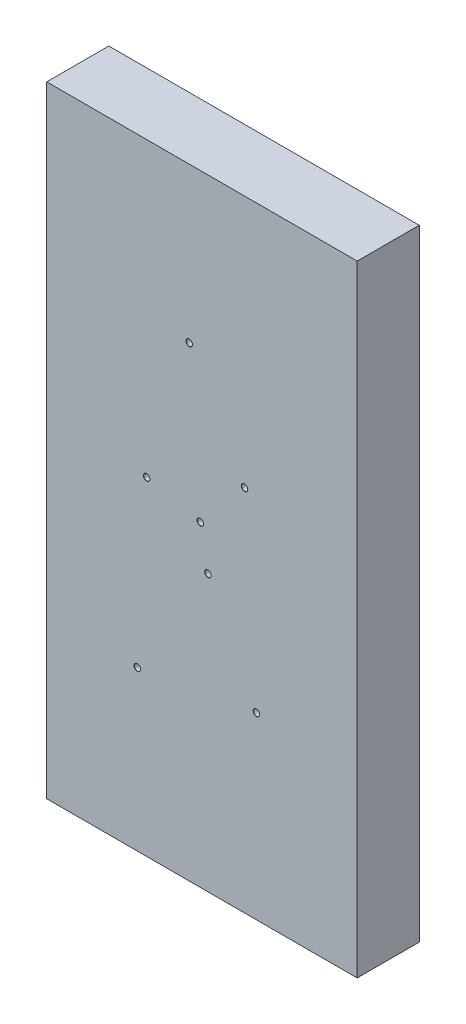
ISO-10303-21;
HEADER;
FILE_DESCRIPTION(('STEP AP214'),'2;1');
FILE_NAME('part.step','',(''),(''),'','','');
FILE_SCHEMA(('AUTOMOTIVE_DESIGN { 1 0 10303 214 1 1 1 1 }'));
ENDSEC;
DATA;
#1=APPLICATION_CONTEXT('core data for automotive mechanical design processes');
#2=APPLICATION_PROTOCOL_DEFINITION('international standard','automotive_design',2000,#1);
#3=PRODUCT_CONTEXT('',#1,'mechanical');
#4=PRODUCT('Part','Part','',(#3));
#5=PRODUCT_RELATED_PRODUCT_CATEGORY('part','',(#4));
#6=PRODUCT_DEFINITION_FORMATION('','',#4);
#7=PRODUCT_DEFINITION_CONTEXT('part definition',#1,'design');
#8=PRODUCT_DEFINITION('design','',#6,#7);
#9=PRODUCT_DEFINITION_SHAPE('','',#8);
#10=(LENGTH_UNIT() NAMED_UNIT(*) SI_UNIT(.MILLI.,.METRE.));
#11=(NAMED_UNIT(*) PLANE_ANGLE_UNIT() SI_UNIT($,.RADIAN.));
#12=(NAMED_UNIT(*) SI_UNIT($,.STERADIAN.) SOLID_ANGLE_UNIT());
#13=UNCERTAINTY_MEASURE_WITH_UNIT(LENGTH_MEASURE(1.E-05),#10,'distance_accuracy_value','');
#14=(GEOMETRIC_REPRESENTATION_CONTEXT(3) GLOBAL_UNCERTAINTY_ASSIGNED_CONTEXT((#13)) GLOBAL_UNIT_ASSIGNED_CONTEXT((#10,
#11,#12)) REPRESENTATION_CONTEXT('',''));
#15=CARTESIAN_POINT('',(0.,0.,0.));
#16=DIRECTION('',(0.,0.,1.));
#17=DIRECTION('',(1.,0.,0.));
#18=AXIS2_PLACEMENT_3D('',#15,#16,#17);
#19=CARTESIAN_POINT('',(-25.,50.,10.));
#20=DIRECTION('',(0.,1.,0.));
#21=DIRECTION('',(0.,0.,1.));
#22=AXIS2_PLACEMENT_3D('',#19,#20,#21);
#23=PLANE('',#22);
#24=DIRECTION('',(1.,0.,0.));
#25=VECTOR('',#24,1.);
#26=CARTESIAN_POINT('',(-25.,50.,0.));
#27=LINE('',#26,#25);
#28=CARTESIAN_POINT('',(-25.,50.,0.));
#29=VERTEX_POINT('',#28);
#30=CARTESIAN_POINT('',(25.,50.,0.));
#31=VERTEX_POINT('',#30);
#32=EDGE_CURVE('E103',#29,#31,#27,.T.);
#33=ORIENTED_EDGE('',*,*,#32,.F.);
#34=DIRECTION('',(0.,0.,-1.));
#35=VECTOR('',#34,1.);
#36=CARTESIAN_POINT('',(-25.,50.,10.));
#37=LINE('',#36,#35);
#38=CARTESIAN_POINT('',(-25.,50.,10.));
#39=VERTEX_POINT('',#38);
#40=EDGE_CURVE('E11',#39,#29,#37,.T.);
#41=ORIENTED_EDGE('',*,*,#40,.F.);
#42=DIRECTION('',(1.,0.,0.));
#43=VECTOR('',#42,1.);
#44=CARTESIAN_POINT('',(-25.,50.,10.));
#45=LINE('',#44,#43);
#46=CARTESIAN_POINT('',(25.,50.,10.));
#47=VERTEX_POINT('',#46);
#48=EDGE_CURVE('E98',#39,#47,#45,.T.);
#49=ORIENTED_EDGE('',*,*,#48,.T.);
#50=DIRECTION('',(0.,0.,-1.));
#51=VECTOR('',#50,1.);
#52=CARTESIAN_POINT('',(25.,50.,10.));
#53=LINE('',#52,#51);
#54=EDGE_CURVE('E45',#47,#31,#53,.T.);
#55=ORIENTED_EDGE('',*,*,#54,.T.);
#56=EDGE_LOOP('',(#33,#41,#49,#55));
#57=FACE_BOUND('',#56,.T.);
#58=ADVANCED_FACE('F39',(#57),#23,.T.);
#59=CARTESIAN_POINT('',(-25.,50.,10.));
#60=DIRECTION('',(1.,0.,0.));
#61=DIRECTION('',(0.,1.,0.));
#62=AXIS2_PLACEMENT_3D('',#59,#60,#61);
#63=PLANE('',#62);
#64=DIRECTION('',(0.,-1.,0.));
#65=VECTOR('',#64,1.);
#66=CARTESIAN_POINT('',(-25.,50.,0.));
#67=LINE('',#66,#65);
#68=CARTESIAN_POINT('',(-25.,-50.,0.));
#69=VERTEX_POINT('',#68);
#70=EDGE_CURVE('E75',#29,#69,#67,.T.);
#71=ORIENTED_EDGE('',*,*,#70,.T.);
#72=DIRECTION('',(0.,0.,-1.));
#73=VECTOR('',#72,1.);
#74=CARTESIAN_POINT('',(-25.,-50.,10.));
#75=LINE('',#74,#73);
#76=CARTESIAN_POINT('',(-25.,-50.,10.));
#77=VERTEX_POINT('',#76);
#78=EDGE_CURVE('E48',#77,#69,#75,.T.);
#79=ORIENTED_EDGE('',*,*,#78,.F.);
#80=DIRECTION('',(0.,-1.,0.));
#81=VECTOR('',#80,1.);
#82=CARTESIAN_POINT('',(-25.,50.,10.));
#83=LINE('',#82,#81);
#84=EDGE_CURVE('E87',#39,#77,#83,.T.);
#85=ORIENTED_EDGE('',*,*,#84,.F.);
#86=ORIENTED_EDGE('',*,*,#40,.T.);
#87=EDGE_LOOP('',(#71,#79,#85,#86));
#88=FACE_BOUND('',#87,.T.);
#89=ADVANCED_FACE('F118',(#88),#63,.F.);
#90=CARTESIAN_POINT('',(-25.,-50.,10.));
#91=DIRECTION('',(0.,1.,0.));
#92=DIRECTION('',(0.,0.,1.));
#93=AXIS2_PLACEMENT_3D('',#90,#91,#92);
#94=PLANE('',#93);
#95=DIRECTION('',(1.,0.,0.));
#96=VECTOR('',#95,1.);
#97=CARTESIAN_POINT('',(-25.,-50.,0.));
#98=LINE('',#97,#96);
#99=CARTESIAN_POINT('',(25.,-50.,0.));
#100=VERTEX_POINT('',#99);
#101=EDGE_CURVE('E96',#69,#100,#98,.T.);
#102=ORIENTED_EDGE('',*,*,#101,.T.);
#103=DIRECTION('',(0.,0.,-1.));
#104=VECTOR('',#103,1.);
#105=CARTESIAN_POINT('',(25.,-50.,10.));
#106=LINE('',#105,#104);
#107=CARTESIAN_POINT('',(25.,-50.,10.));
#108=VERTEX_POINT('',#107);
#109=EDGE_CURVE('E93',#108,#100,#106,.T.);
#110=ORIENTED_EDGE('',*,*,#109,.F.);
#111=DIRECTION('',(1.,0.,0.));
#112=VECTOR('',#111,1.);
#113=CARTESIAN_POINT('',(-25.,-50.,10.));
#114=LINE('',#113,#112);
#115=EDGE_CURVE('E84',#77,#108,#114,.T.);
#116=ORIENTED_EDGE('',*,*,#115,.F.);
#117=ORIENTED_EDGE('',*,*,#78,.T.);
#118=EDGE_LOOP('',(#102,#110,#116,#117));
#119=FACE_BOUND('',#118,.T.);
#120=ADVANCED_FACE('F92',(#119),#94,.F.);
#121=CARTESIAN_POINT('',(25.,50.,10.));
#122=DIRECTION('',(1.,0.,0.));
#123=DIRECTION('',(0.,1.,0.));
#124=AXIS2_PLACEMENT_3D('',#121,#122,#123);
#125=PLANE('',#124);
#126=DIRECTION('',(0.,-1.,0.));
#127=VECTOR('',#126,1.);
#128=CARTESIAN_POINT('',(25.,50.,0.));
#129=LINE('',#128,#127);
#130=EDGE_CURVE('E106',#31,#100,#129,.T.);
#131=ORIENTED_EDGE('',*,*,#130,.F.);
#132=ORIENTED_EDGE('',*,*,#54,.F.);
#133=DIRECTION('',(0.,-1.,0.));
#134=VECTOR('',#133,1.);
#135=CARTESIAN_POINT('',(25.,50.,10.));
#136=LINE('',#135,#134);
#137=EDGE_CURVE('E88',#47,#108,#136,.T.);
#138=ORIENTED_EDGE('',*,*,#137,.T.);
#139=ORIENTED_EDGE('',*,*,#109,.T.);
#140=EDGE_LOOP('',(#131,#132,#138,#139));
#141=FACE_BOUND('',#140,.T.);
#142=ADVANCED_FACE('F97',(#141),#125,.T.);
#143=CARTESIAN_POINT('',(0.,0.,10.));
#144=DIRECTION('',(0.,0.,-1.));
#145=DIRECTION('',(-1.,0.,0.));
#146=AXIS2_PLACEMENT_3D('',#143,#144,#145);
#147=PLANE('',#146);
#148=CARTESIAN_POINT('',(-0.274115762512961,0.959405168795363,10.));
#149=DIRECTION('',(0.,0.,1.));
#150=DIRECTION('',(1.,0.,0.));
#151=AXIS2_PLACEMENT_3D('',#148,#149,#150);
#152=CIRCLE('',#151,0.524999999999999);
#153=CARTESIAN_POINT('',(0.250884237487039,0.959405168795363,10.));
#154=VERTEX_POINT('',#153);
#155=EDGE_CURVE('E202',#154,#154,#152,.T.);
#156=ORIENTED_EDGE('',*,*,#155,.F.);
#157=EDGE_LOOP('',(#156));
#158=FACE_BOUND('',#157,.T.);
#159=CARTESIAN_POINT('',(0.959405168795363,-5.61937313151559,10.));
#160=DIRECTION('',(0.,0.,1.));
#161=DIRECTION('',(1.,0.,0.));
#162=AXIS2_PLACEMENT_3D('',#159,#160,#161);
#163=CIRCLE('',#162,0.524999999999999);
#164=CARTESIAN_POINT('',(1.48440516879536,-5.61937313151559,10.));
#165=VERTEX_POINT('',#164);
#166=EDGE_CURVE('E206',#165,#165,#163,.T.);
#167=ORIENTED_EDGE('',*,*,#166,.F.);
#168=EDGE_LOOP('',(#167));
#169=FACE_BOUND('',#168,.T.);
#170=CARTESIAN_POINT('',(-8.90876228167106,2.87821550638606,10.));
#171=DIRECTION('',(0.,0.,1.));
#172=DIRECTION('',(1.,0.,0.));
#173=AXIS2_PLACEMENT_3D('',#170,#171,#172);
#174=CIRCLE('',#173,0.524999999999999);
#175=CARTESIAN_POINT('',(-8.38376228167106,2.87821550638606,10.));
#176=VERTEX_POINT('',#175);
#177=EDGE_CURVE('E220',#176,#176,#174,.T.);
#178=ORIENTED_EDGE('',*,*,#177,.F.);
#179=EDGE_LOOP('',(#178));
#180=FACE_BOUND('',#179,.T.);
#181=CARTESIAN_POINT('',(6.85289406282391,9.31993592544053,10.));
#182=DIRECTION('',(0.,0.,1.));
#183=DIRECTION('',(1.,0.,0.));
#184=AXIS2_PLACEMENT_3D('',#181,#182,#183);
#185=CIRCLE('',#184,0.524999999999999);
#186=CARTESIAN_POINT('',(7.37789406282391,9.31993592544053,10.));
#187=VERTEX_POINT('',#186);
#188=EDGE_CURVE('E226',#187,#187,#185,.T.);
#189=ORIENTED_EDGE('',*,*,#188,.F.);
#190=EDGE_LOOP('',(#189));
#191=FACE_BOUND('',#190,.T.);
#192=CARTESIAN_POINT('',(-2.05586821884718,25.0815922699355,10.));
#193=DIRECTION('',(0.,0.,1.));
#194=DIRECTION('',(1.,0.,0.));
#195=AXIS2_PLACEMENT_3D('',#192,#193,#194);
#196=CIRCLE('',#195,0.524999999999999);
#197=CARTESIAN_POINT('',(-1.53086821884718,25.0815922699355,10.));
#198=VERTEX_POINT('',#197);
#199=EDGE_CURVE('E234',#198,#198,#196,.T.);
#200=ORIENTED_EDGE('',*,*,#199,.F.);
#201=EDGE_LOOP('',(#200));
#202=FACE_BOUND('',#201,.T.);
#203=CARTESIAN_POINT('',(8.77170440041461,-21.1069137134976,10.));
#204=DIRECTION('',(0.,0.,1.));
#205=DIRECTION('',(1.,0.,0.));
#206=AXIS2_PLACEMENT_3D('',#203,#204,#205);
#207=CIRCLE('',#206,0.524999999999999);
#208=CARTESIAN_POINT('',(9.29670440041461,-21.1069137134976,10.));
#209=VERTEX_POINT('',#208);
#210=EDGE_CURVE('E242',#209,#209,#207,.T.);
#211=ORIENTED_EDGE('',*,*,#210,.F.);
#212=EDGE_LOOP('',(#211));
#213=FACE_BOUND('',#212,.T.);
#214=CARTESIAN_POINT('',(-10.4163989754923,-24.3963028636531,10.));
#215=DIRECTION('',(0.,0.,1.));
#216=DIRECTION('',(1.,0.,0.));
#217=AXIS2_PLACEMENT_3D('',#214,#215,#216);
#218=CIRCLE('',#217,0.524999999999999);
#219=CARTESIAN_POINT('',(-9.89139897549235,-24.3963028636531,10.));
#220=VERTEX_POINT('',#219);
#221=EDGE_CURVE('E251',#220,#220,#218,.T.);
#222=ORIENTED_EDGE('',*,*,#221,.F.);
#223=EDGE_LOOP('',(#222));
#224=FACE_BOUND('',#223,.T.);
#225=ORIENTED_EDGE('',*,*,#48,.F.);
#226=ORIENTED_EDGE('',*,*,#84,.T.);
#227=ORIENTED_EDGE('',*,*,#115,.T.);
#228=ORIENTED_EDGE('',*,*,#137,.F.);
#229=EDGE_LOOP('',(#225,#226,#227,#228));
#230=FACE_BOUND('',#229,.T.);
#231=ADVANCED_FACE('F90',(#158,#169,#180,#191,#202,#213,#224,#230),#147,.F.);
#232=CARTESIAN_POINT('',(0.,0.,0.));
#233=DIRECTION('',(0.,0.,-1.));
#234=DIRECTION('',(-1.,0.,0.));
#235=AXIS2_PLACEMENT_3D('',#232,#233,#234);
#236=PLANE('',#235);
#237=CARTESIAN_POINT('',(-0.274115762512961,0.959405168795363,0.));
#238=DIRECTION('',(0.,0.,1.));
#239=DIRECTION('',(1.,0.,0.));
#240=AXIS2_PLACEMENT_3D('',#237,#238,#239);
#241=CIRCLE('',#240,0.499999999999999);
#242=CARTESIAN_POINT('',(0.225884237487038,0.959405168795363,0.));
#243=VERTEX_POINT('',#242);
#244=EDGE_CURVE('E201',#243,#243,#241,.T.);
#245=ORIENTED_EDGE('',*,*,#244,.T.);
#246=EDGE_LOOP('',(#245));
#247=FACE_BOUND('',#246,.T.);
#248=CARTESIAN_POINT('',(0.959405168795363,-5.61937313151559,0.));
#249=DIRECTION('',(0.,0.,1.));
#250=DIRECTION('',(1.,0.,0.));
#251=AXIS2_PLACEMENT_3D('',#248,#249,#250);
#252=CIRCLE('',#251,0.499999999999999);
#253=CARTESIAN_POINT('',(1.45940516879536,-5.61937313151559,0.));
#254=VERTEX_POINT('',#253);
#255=EDGE_CURVE('E215',#254,#254,#252,.T.);
#256=ORIENTED_EDGE('',*,*,#255,.T.);
#257=EDGE_LOOP('',(#256));
#258=FACE_BOUND('',#257,.T.);
#259=CARTESIAN_POINT('',(-8.90876228167106,2.87821550638606,0.));
#260=DIRECTION('',(0.,0.,1.));
#261=DIRECTION('',(1.,0.,0.));
#262=AXIS2_PLACEMENT_3D('',#259,#260,#261);
#263=CIRCLE('',#262,0.499999999999999);
#264=CARTESIAN_POINT('',(-8.40876228167106,2.87821550638606,0.));
#265=VERTEX_POINT('',#264);
#266=EDGE_CURVE('E223',#265,#265,#263,.T.);
#267=ORIENTED_EDGE('',*,*,#266,.T.);
#268=EDGE_LOOP('',(#267));
#269=FACE_BOUND('',#268,.T.);
#270=CARTESIAN_POINT('',(6.85289406282391,9.31993592544053,0.));
#271=DIRECTION('',(0.,0.,1.));
#272=DIRECTION('',(1.,0.,0.));
#273=AXIS2_PLACEMENT_3D('',#270,#271,#272);
#274=CIRCLE('',#273,0.499999999999999);
#275=CARTESIAN_POINT('',(7.35289406282391,9.31993592544053,0.));
#276=VERTEX_POINT('',#275);
#277=EDGE_CURVE('E235',#276,#276,#274,.T.);
#278=ORIENTED_EDGE('',*,*,#277,.T.);
#279=EDGE_LOOP('',(#278));
#280=FACE_BOUND('',#279,.T.);
#281=CARTESIAN_POINT('',(-2.05586821884718,25.0815922699355,0.));
#282=DIRECTION('',(0.,0.,1.));
#283=DIRECTION('',(1.,0.,0.));
#284=AXIS2_PLACEMENT_3D('',#281,#282,#283);
#285=CIRCLE('',#284,0.499999999999999);
#286=CARTESIAN_POINT('',(-1.55586821884718,25.0815922699355,0.));
#287=VERTEX_POINT('',#286);
#288=EDGE_CURVE('E243',#287,#287,#285,.T.);
#289=ORIENTED_EDGE('',*,*,#288,.T.);
#290=EDGE_LOOP('',(#289));
#291=FACE_BOUND('',#290,.T.);
#292=CARTESIAN_POINT('',(8.77170440041461,-21.1069137134976,0.));
#293=DIRECTION('',(0.,0.,1.));
#294=DIRECTION('',(1.,0.,0.));
#295=AXIS2_PLACEMENT_3D('',#292,#293,#294);
#296=CIRCLE('',#295,0.499999999999999);
#297=CARTESIAN_POINT('',(9.27170440041461,-21.1069137134976,0.));
#298=VERTEX_POINT('',#297);
#299=EDGE_CURVE('E248',#298,#298,#296,.T.);
#300=ORIENTED_EDGE('',*,*,#299,.T.);
#301=EDGE_LOOP('',(#300));
#302=FACE_BOUND('',#301,.T.);
#303=CARTESIAN_POINT('',(-10.4163989754923,-24.3963028636531,0.));
#304=DIRECTION('',(0.,0.,1.));
#305=DIRECTION('',(1.,0.,0.));
#306=AXIS2_PLACEMENT_3D('',#303,#304,#305);
#307=CIRCLE('',#306,0.499999999999999);
#308=CARTESIAN_POINT('',(-9.91639897549235,-24.3963028636531,0.));
#309=VERTEX_POINT('',#308);
#310=EDGE_CURVE('E107',#309,#309,#307,.T.);
#311=ORIENTED_EDGE('',*,*,#310,.T.);
#312=EDGE_LOOP('',(#311));
#313=FACE_BOUND('',#312,.T.);
#314=ORIENTED_EDGE('',*,*,#32,.T.);
#315=ORIENTED_EDGE('',*,*,#130,.T.);
#316=ORIENTED_EDGE('',*,*,#101,.F.);
#317=ORIENTED_EDGE('',*,*,#70,.F.);
#318=EDGE_LOOP('',(#314,#315,#316,#317));
#319=FACE_BOUND('',#318,.T.);
#320=ADVANCED_FACE('F114',(#247,#258,#269,#280,#291,#302,#313,#319),#236,.T.);
#321=CARTESIAN_POINT('',(-10.4163989754923,-24.3963028636531,10.));
#322=DIRECTION('',(0.,0.,1.));
#323=DIRECTION('',(1.,0.,0.));
#324=AXIS2_PLACEMENT_3D('',#321,#322,#323);
#325=CYLINDRICAL_SURFACE('',#324,0.5);
#326=ORIENTED_EDGE('',*,*,#310,.F.);
#327=EDGE_LOOP('',(#326));
#328=FACE_BOUND('',#327,.T.);
#329=CARTESIAN_POINT('',(-10.4163989754923,-24.3963028636531,9.975));
#330=DIRECTION('',(0.,0.,1.));
#331=DIRECTION('',(1.,0.,0.));
#332=AXIS2_PLACEMENT_3D('',#329,#330,#331);
#333=CIRCLE('',#332,0.5);
#334=CARTESIAN_POINT('',(-9.91639897549235,-24.3963028636531,9.975));
#335=VERTEX_POINT('',#334);
#336=EDGE_CURVE('E258',#335,#335,#333,.T.);
#337=ORIENTED_EDGE('',*,*,#336,.T.);
#338=EDGE_LOOP('',(#337));
#339=FACE_BOUND('',#338,.T.);
#340=ADVANCED_FACE('F134',(#328,#339),#325,.F.);
#341=CARTESIAN_POINT('',(-10.4163989754923,-24.3963028636531,10.));
#342=DIRECTION('',(0.,0.,1.));
#343=DIRECTION('',(1.,0.,0.));
#344=AXIS2_PLACEMENT_3D('',#341,#342,#343);
#345=CONICAL_SURFACE('',#344,0.524999999999999,0.785398163397379);
#346=ORIENTED_EDGE('',*,*,#336,.F.);
#347=EDGE_LOOP('',(#346));
#348=FACE_BOUND('',#347,.T.);
#349=ORIENTED_EDGE('',*,*,#221,.T.);
#350=EDGE_LOOP('',(#349));
#351=FACE_BOUND('',#350,.T.);
#352=ADVANCED_FACE('F145',(#348,#351),#345,.F.);
#353=CARTESIAN_POINT('',(8.77170440041461,-21.1069137134976,10.));
#354=DIRECTION('',(0.,0.,1.));
#355=DIRECTION('',(1.,0.,0.));
#356=AXIS2_PLACEMENT_3D('',#353,#354,#355);
#357=CYLINDRICAL_SURFACE('',#356,0.5);
#358=ORIENTED_EDGE('',*,*,#299,.F.);
#359=EDGE_LOOP('',(#358));
#360=FACE_BOUND('',#359,.T.);
#361=CARTESIAN_POINT('',(8.77170440041461,-21.1069137134976,9.975));
#362=DIRECTION('',(0.,0.,1.));
#363=DIRECTION('',(1.,0.,0.));
#364=AXIS2_PLACEMENT_3D('',#361,#362,#363);
#365=CIRCLE('',#364,0.5);
#366=CARTESIAN_POINT('',(9.27170440041461,-21.1069137134976,9.975));
#367=VERTEX_POINT('',#366);
#368=EDGE_CURVE('E250',#367,#367,#365,.T.);
#369=ORIENTED_EDGE('',*,*,#368,.T.);
#370=EDGE_LOOP('',(#369));
#371=FACE_BOUND('',#370,.T.);
#372=ADVANCED_FACE('F147',(#360,#371),#357,.F.);
#373=CARTESIAN_POINT('',(8.77170440041461,-21.1069137134976,10.));
#374=DIRECTION('',(0.,0.,1.));
#375=DIRECTION('',(1.,0.,0.));
#376=AXIS2_PLACEMENT_3D('',#373,#374,#375);
#377=CONICAL_SURFACE('',#376,0.524999999999999,0.785398163397379);
#378=ORIENTED_EDGE('',*,*,#368,.F.);
#379=EDGE_LOOP('',(#378));
#380=FACE_BOUND('',#379,.T.);
#381=ORIENTED_EDGE('',*,*,#210,.T.);
#382=EDGE_LOOP('',(#381));
#383=FACE_BOUND('',#382,.T.);
#384=ADVANCED_FACE('F148',(#380,#383),#377,.F.);
#385=CARTESIAN_POINT('',(-2.05586821884718,25.0815922699355,10.));
#386=DIRECTION('',(0.,0.,1.));
#387=DIRECTION('',(1.,0.,0.));
#388=AXIS2_PLACEMENT_3D('',#385,#386,#387);
#389=CYLINDRICAL_SURFACE('',#388,0.499999999999999);
#390=ORIENTED_EDGE('',*,*,#288,.F.);
#391=EDGE_LOOP('',(#390));
#392=FACE_BOUND('',#391,.T.);
#393=CARTESIAN_POINT('',(-2.05586821884718,25.0815922699355,9.975));
#394=DIRECTION('',(0.,0.,1.));
#395=DIRECTION('',(1.,0.,0.));
#396=AXIS2_PLACEMENT_3D('',#393,#394,#395);
#397=CIRCLE('',#396,0.5);
#398=CARTESIAN_POINT('',(-1.55586821884718,25.0815922699355,9.975));
#399=VERTEX_POINT('',#398);
#400=EDGE_CURVE('E239',#399,#399,#397,.T.);
#401=ORIENTED_EDGE('',*,*,#400,.T.);
#402=EDGE_LOOP('',(#401));
#403=FACE_BOUND('',#402,.T.);
#404=ADVANCED_FACE('F152',(#392,#403),#389,.F.);
#405=CARTESIAN_POINT('',(-2.05586821884718,25.0815922699355,10.));
#406=DIRECTION('',(0.,0.,1.));
#407=DIRECTION('',(1.,0.,0.));
#408=AXIS2_PLACEMENT_3D('',#405,#406,#407);
#409=CONICAL_SURFACE('',#408,0.524999999999999,0.785398163397388);
#410=ORIENTED_EDGE('',*,*,#400,.F.);
#411=EDGE_LOOP('',(#410));
#412=FACE_BOUND('',#411,.T.);
#413=ORIENTED_EDGE('',*,*,#199,.T.);
#414=EDGE_LOOP('',(#413));
#415=FACE_BOUND('',#414,.T.);
#416=ADVANCED_FACE('F156',(#412,#415),#409,.F.);
#417=CARTESIAN_POINT('',(6.85289406282391,9.31993592544053,10.));
#418=DIRECTION('',(0.,0.,1.));
#419=DIRECTION('',(1.,0.,0.));
#420=AXIS2_PLACEMENT_3D('',#417,#418,#419);
#421=CYLINDRICAL_SURFACE('',#420,0.5);
#422=ORIENTED_EDGE('',*,*,#277,.F.);
#423=EDGE_LOOP('',(#422));
#424=FACE_BOUND('',#423,.T.);
#425=CARTESIAN_POINT('',(6.85289406282391,9.31993592544053,9.975));
#426=DIRECTION('',(0.,0.,1.));
#427=DIRECTION('',(1.,0.,0.));
#428=AXIS2_PLACEMENT_3D('',#425,#426,#427);
#429=CIRCLE('',#428,0.5);
#430=CARTESIAN_POINT('',(7.35289406282391,9.31993592544053,9.975));
#431=VERTEX_POINT('',#430);
#432=EDGE_CURVE('E227',#431,#431,#429,.T.);
#433=ORIENTED_EDGE('',*,*,#432,.T.);
#434=EDGE_LOOP('',(#433));
#435=FACE_BOUND('',#434,.T.);
#436=ADVANCED_FACE('F165',(#424,#435),#421,.F.);
#437=CARTESIAN_POINT('',(6.85289406282391,9.31993592544053,10.));
#438=DIRECTION('',(0.,0.,1.));
#439=DIRECTION('',(1.,0.,0.));
#440=AXIS2_PLACEMENT_3D('',#437,#438,#439);
#441=CONICAL_SURFACE('',#440,0.524999999999999,0.785398163397379);
#442=ORIENTED_EDGE('',*,*,#432,.F.);
#443=EDGE_LOOP('',(#442));
#444=FACE_BOUND('',#443,.T.);
#445=ORIENTED_EDGE('',*,*,#188,.T.);
#446=EDGE_LOOP('',(#445));
#447=FACE_BOUND('',#446,.T.);
#448=ADVANCED_FACE('F168',(#444,#447),#441,.F.);
#449=CARTESIAN_POINT('',(-8.90876228167106,2.87821550638606,10.));
#450=DIRECTION('',(0.,0.,1.));
#451=DIRECTION('',(1.,0.,0.));
#452=AXIS2_PLACEMENT_3D('',#449,#450,#451);
#453=CYLINDRICAL_SURFACE('',#452,0.5);
#454=ORIENTED_EDGE('',*,*,#266,.F.);
#455=EDGE_LOOP('',(#454));
#456=FACE_BOUND('',#455,.T.);
#457=CARTESIAN_POINT('',(-8.90876228167106,2.87821550638606,9.975));
#458=DIRECTION('',(0.,0.,1.));
#459=DIRECTION('',(1.,0.,0.));
#460=AXIS2_PLACEMENT_3D('',#457,#458,#459);
#461=CIRCLE('',#460,0.5);
#462=CARTESIAN_POINT('',(-8.40876228167106,2.87821550638606,9.975));
#463=VERTEX_POINT('',#462);
#464=EDGE_CURVE('E217',#463,#463,#461,.T.);
#465=ORIENTED_EDGE('',*,*,#464,.T.);
#466=EDGE_LOOP('',(#465));
#467=FACE_BOUND('',#466,.T.);
#468=ADVANCED_FACE('F169',(#456,#467),#453,.F.);
#469=CARTESIAN_POINT('',(-8.90876228167106,2.87821550638606,10.));
#470=DIRECTION('',(0.,0.,1.));
#471=DIRECTION('',(1.,0.,0.));
#472=AXIS2_PLACEMENT_3D('',#469,#470,#471);
#473=CONICAL_SURFACE('',#472,0.524999999999999,0.785398163397379);
#474=ORIENTED_EDGE('',*,*,#464,.F.);
#475=EDGE_LOOP('',(#474));
#476=FACE_BOUND('',#475,.T.);
#477=ORIENTED_EDGE('',*,*,#177,.T.);
#478=EDGE_LOOP('',(#477));
#479=FACE_BOUND('',#478,.T.);
#480=ADVANCED_FACE('F174',(#476,#479),#473,.F.);
#481=CARTESIAN_POINT('',(0.959405168795363,-5.61937313151559,10.));
#482=DIRECTION('',(0.,0.,1.));
#483=DIRECTION('',(1.,0.,0.));
#484=AXIS2_PLACEMENT_3D('',#481,#482,#483);
#485=CYLINDRICAL_SURFACE('',#484,0.499999999999999);
#486=ORIENTED_EDGE('',*,*,#255,.F.);
#487=EDGE_LOOP('',(#486));
#488=FACE_BOUND('',#487,.T.);
#489=CARTESIAN_POINT('',(0.959405168795363,-5.61937313151559,9.975));
#490=DIRECTION('',(0.,0.,1.));
#491=DIRECTION('',(1.,0.,0.));
#492=AXIS2_PLACEMENT_3D('',#489,#490,#491);
#493=CIRCLE('',#492,0.5);
#494=CARTESIAN_POINT('',(1.45940516879536,-5.61937313151559,9.975));
#495=VERTEX_POINT('',#494);
#496=EDGE_CURVE('E213',#495,#495,#493,.T.);
#497=ORIENTED_EDGE('',*,*,#496,.T.);
#498=EDGE_LOOP('',(#497));
#499=FACE_BOUND('',#498,.T.);
#500=ADVANCED_FACE('F178',(#488,#499),#485,.F.);
#501=CARTESIAN_POINT('',(0.959405168795363,-5.61937313151559,10.));
#502=DIRECTION('',(0.,0.,1.));
#503=DIRECTION('',(1.,0.,0.));
#504=AXIS2_PLACEMENT_3D('',#501,#502,#503);
#505=CONICAL_SURFACE('',#504,0.524999999999999,0.785398163397388);
#506=ORIENTED_EDGE('',*,*,#496,.F.);
#507=EDGE_LOOP('',(#506));
#508=FACE_BOUND('',#507,.T.);
#509=ORIENTED_EDGE('',*,*,#166,.T.);
#510=EDGE_LOOP('',(#509));
#511=FACE_BOUND('',#510,.T.);
#512=ADVANCED_FACE('F185',(#508,#511),#505,.F.);
#513=CARTESIAN_POINT('',(-0.274115762512961,0.959405168795363,10.));
#514=DIRECTION('',(0.,0.,1.));
#515=DIRECTION('',(1.,0.,0.));
#516=AXIS2_PLACEMENT_3D('',#513,#514,#515);
#517=CYLINDRICAL_SURFACE('',#516,0.499999999999999);
#518=ORIENTED_EDGE('',*,*,#244,.F.);
#519=EDGE_LOOP('',(#518));
#520=FACE_BOUND('',#519,.T.);
#521=CARTESIAN_POINT('',(-0.274115762512961,0.959405168795363,9.975));
#522=DIRECTION('',(0.,0.,1.));
#523=DIRECTION('',(1.,0.,0.));
#524=AXIS2_PLACEMENT_3D('',#521,#522,#523);
#525=CIRCLE('',#524,0.5);
#526=CARTESIAN_POINT('',(0.225884237487039,0.959405168795363,9.975));
#527=VERTEX_POINT('',#526);
#528=EDGE_CURVE('E197',#527,#527,#525,.T.);
#529=ORIENTED_EDGE('',*,*,#528,.T.);
#530=EDGE_LOOP('',(#529));
#531=FACE_BOUND('',#530,.T.);
#532=ADVANCED_FACE('F186',(#520,#531),#517,.F.);
#533=CARTESIAN_POINT('',(-0.274115762512961,0.959405168795363,10.));
#534=DIRECTION('',(0.,0.,1.));
#535=DIRECTION('',(1.,0.,0.));
#536=AXIS2_PLACEMENT_3D('',#533,#534,#535);
#537=CONICAL_SURFACE('',#536,0.524999999999999,0.785398163397388);
#538=ORIENTED_EDGE('',*,*,#528,.F.);
#539=EDGE_LOOP('',(#538));
#540=FACE_BOUND('',#539,.T.);
#541=ORIENTED_EDGE('',*,*,#155,.T.);
#542=EDGE_LOOP('',(#541));
#543=FACE_BOUND('',#542,.T.);
#544=ADVANCED_FACE('F189',(#540,#543),#537,.F.);
#545=CLOSED_SHELL('',(#58,#89,#120,#142,#231,#320,#340,#352,#372,#384,#404,#416,#436,#448,#468,
#480,#500,#512,#532,#544));
#546=MANIFOLD_SOLID_BREP('B2',#545);
#547=ADVANCED_BREP_SHAPE_REPRESENTATION('',(#18,#546),#14);
#548=SHAPE_DEFINITION_REPRESENTATION(#9,#547);
ENDSEC;
END-ISO-10303-21;
